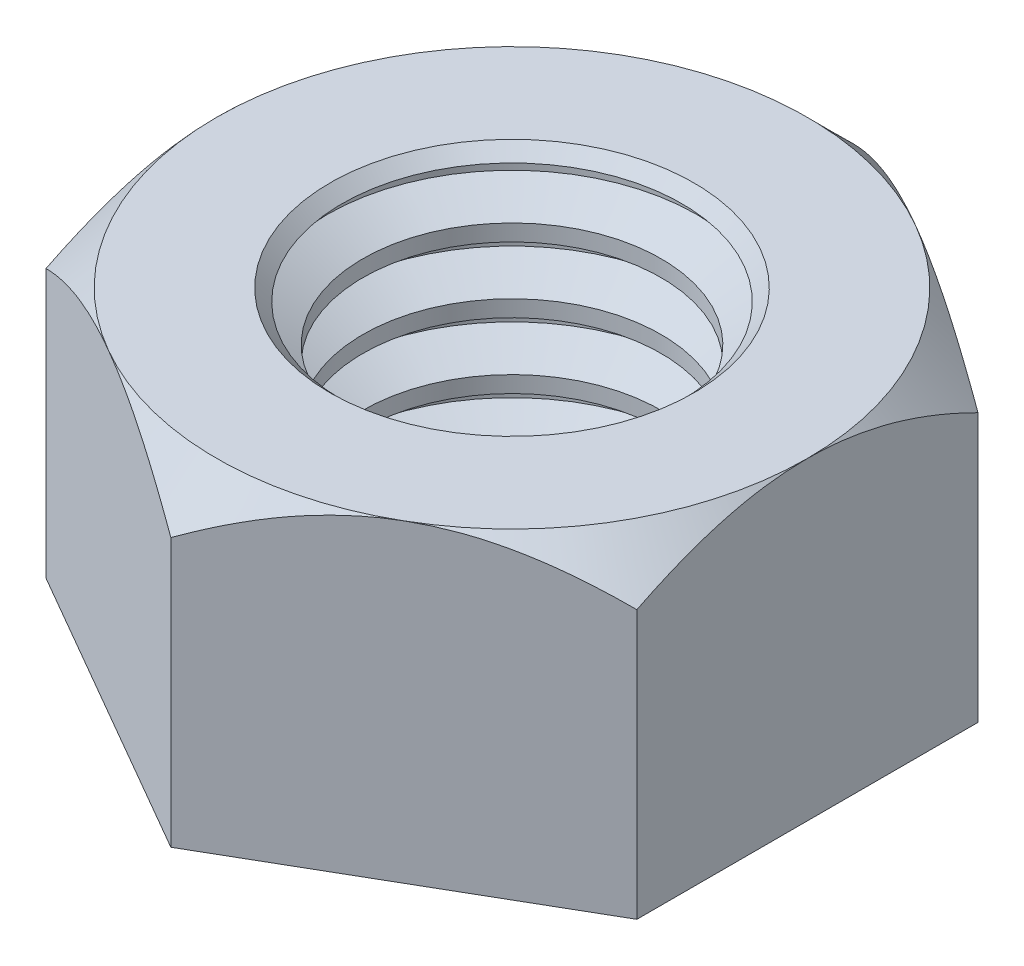
ISO-10303-21;
HEADER;
FILE_DESCRIPTION(('STEP AP214'),'2;1');
FILE_NAME('part.step','',(''),(''),'','','');
FILE_SCHEMA(('AUTOMOTIVE_DESIGN { 1 0 10303 214 1 1 1 1 }'));
ENDSEC;
DATA;
#1=APPLICATION_CONTEXT('core data for automotive mechanical design processes');
#2=APPLICATION_PROTOCOL_DEFINITION('international standard','automotive_design',2000,#1);
#3=PRODUCT_CONTEXT('',#1,'mechanical');
#4=PRODUCT('Part','Part','',(#3));
#5=PRODUCT_RELATED_PRODUCT_CATEGORY('part','',(#4));
#6=PRODUCT_DEFINITION_FORMATION('','',#4);
#7=PRODUCT_DEFINITION_CONTEXT('part definition',#1,'design');
#8=PRODUCT_DEFINITION('design','',#6,#7);
#9=PRODUCT_DEFINITION_SHAPE('','',#8);
#10=(LENGTH_UNIT() NAMED_UNIT(*) SI_UNIT(.MILLI.,.METRE.));
#11=(NAMED_UNIT(*) PLANE_ANGLE_UNIT() SI_UNIT($,.RADIAN.));
#12=(NAMED_UNIT(*) SI_UNIT($,.STERADIAN.) SOLID_ANGLE_UNIT());
#13=UNCERTAINTY_MEASURE_WITH_UNIT(LENGTH_MEASURE(1.E-05),#10,'distance_accuracy_value','');
#14=(GEOMETRIC_REPRESENTATION_CONTEXT(3) GLOBAL_UNCERTAINTY_ASSIGNED_CONTEXT((#13)) GLOBAL_UNIT_ASSIGNED_CONTEXT((#10,
#11,#12)) REPRESENTATION_CONTEXT('',''));
#15=CARTESIAN_POINT('',(0.,0.,0.));
#16=DIRECTION('',(0.,0.,1.));
#17=DIRECTION('',(1.,0.,0.));
#18=AXIS2_PLACEMENT_3D('',#15,#16,#17);
#19=CARTESIAN_POINT('',(-6.35,0.,-10.9985226280624));
#20=DIRECTION('',(0.,1.,0.));
#21=DIRECTION('',(0.,0.,1.));
#22=AXIS2_PLACEMENT_3D('',#19,#20,#21);
#23=PLANE('',#22);
#24=DIRECTION('',(-0.866025403784439,0.,-0.5));
#25=VECTOR('',#24,1.);
#26=CARTESIAN_POINT('',(6.35,0.,-3.66617420935413));
#27=LINE('',#26,#25);
#28=CARTESIAN_POINT('',(6.35,0.,-3.66617420935413));
#29=VERTEX_POINT('',#28);
#30=CARTESIAN_POINT('',(0.,0.,-7.33234841870825));
#31=VERTEX_POINT('',#30);
#32=EDGE_CURVE('E265',#29,#31,#27,.T.);
#33=ORIENTED_EDGE('',*,*,#32,.F.);
#34=DIRECTION('',(0.,0.,-1.));
#35=VECTOR('',#34,1.);
#36=CARTESIAN_POINT('',(6.35,0.,3.66617420935413));
#37=LINE('',#36,#35);
#38=CARTESIAN_POINT('',(6.35,0.,3.66617420935413));
#39=VERTEX_POINT('',#38);
#40=EDGE_CURVE('E272',#39,#29,#37,.T.);
#41=ORIENTED_EDGE('',*,*,#40,.F.);
#42=DIRECTION('',(0.866025403784439,0.,-0.5));
#43=VECTOR('',#42,1.);
#44=CARTESIAN_POINT('',(0.,0.,7.33234841870825));
#45=LINE('',#44,#43);
#46=CARTESIAN_POINT('',(0.,0.,7.33234841870825));
#47=VERTEX_POINT('',#46);
#48=EDGE_CURVE('E268',#47,#39,#45,.T.);
#49=ORIENTED_EDGE('',*,*,#48,.F.);
#50=DIRECTION('',(0.866025403784439,0.,0.5));
#51=VECTOR('',#50,1.);
#52=CARTESIAN_POINT('',(-6.35,0.,3.66617420935412));
#53=LINE('',#52,#51);
#54=CARTESIAN_POINT('',(-6.35,0.,3.66617420935412));
#55=VERTEX_POINT('',#54);
#56=EDGE_CURVE('E126',#55,#47,#53,.T.);
#57=ORIENTED_EDGE('',*,*,#56,.F.);
#58=DIRECTION('',(0.,0.,1.));
#59=VECTOR('',#58,1.);
#60=CARTESIAN_POINT('',(-6.35,0.,-3.66617420935413));
#61=LINE('',#60,#59);
#62=CARTESIAN_POINT('',(-6.35,0.,-3.66617420935413));
#63=VERTEX_POINT('',#62);
#64=EDGE_CURVE('E264',#63,#55,#61,.T.);
#65=ORIENTED_EDGE('',*,*,#64,.F.);
#66=DIRECTION('',(-0.866025403784439,0.,0.5));
#67=VECTOR('',#66,1.);
#68=CARTESIAN_POINT('',(0.,0.,-7.33234841870825));
#69=LINE('',#68,#67);
#70=EDGE_CURVE('E260',#31,#63,#69,.T.);
#71=ORIENTED_EDGE('',*,*,#70,.F.);
#72=EDGE_LOOP('',(#33,#41,#49,#57,#65,#71));
#73=FACE_BOUND('',#72,.T.);
#74=CARTESIAN_POINT('',(0.,0.,0.));
#75=DIRECTION('',(0.,1.,0.));
#76=DIRECTION('',(0.,0.,1.));
#77=AXIS2_PLACEMENT_3D('',#74,#75,#76);
#78=CIRCLE('',#77,3.20496370638455);
#79=CARTESIAN_POINT('',(0.,0.,3.20496370638455));
#80=VERTEX_POINT('',#79);
#81=EDGE_CURVE('E143',#80,#80,#78,.F.);
#82=ORIENTED_EDGE('',*,*,#81,.F.);
#83=EDGE_LOOP('',(#82));
#84=FACE_BOUND('',#83,.T.);
#85=ADVANCED_FACE('F33',(#73,#84),#23,.F.);
#86=CARTESIAN_POINT('',(-6.35,6.746875,-10.9985226280624));
#87=DIRECTION('',(0.,1.,0.));
#88=DIRECTION('',(0.,0.,1.));
#89=AXIS2_PLACEMENT_3D('',#86,#87,#88);
#90=PLANE('',#89);
#91=CARTESIAN_POINT('',(0.,6.746875,0.));
#92=DIRECTION('',(0.,1.,0.));
#93=DIRECTION('',(0.,0.,1.));
#94=AXIS2_PLACEMENT_3D('',#91,#92,#93);
#95=CIRCLE('',#94,3.91051926194011);
#96=CARTESIAN_POINT('',(0.,6.746875,3.91051926194011));
#97=VERTEX_POINT('',#96);
#98=EDGE_CURVE('E12',#97,#97,#95,.F.);
#99=ORIENTED_EDGE('',*,*,#98,.T.);
#100=EDGE_LOOP('',(#99));
#101=FACE_BOUND('',#100,.T.);
#102=CARTESIAN_POINT('',(0.,6.746875,0.));
#103=DIRECTION('',(0.,1.,0.));
#104=DIRECTION('',(0.,0.,1.));
#105=AXIS2_PLACEMENT_3D('',#102,#103,#104);
#106=CIRCLE('',#105,6.35);
#107=CARTESIAN_POINT('',(-3.175,6.746875,5.49926131403118));
#108=VERTEX_POINT('',#107);
#109=CARTESIAN_POINT('',(3.175,6.746875,5.49926131403119));
#110=VERTEX_POINT('',#109);
#111=EDGE_CURVE('E108',#108,#110,#106,.T.);
#112=ORIENTED_EDGE('',*,*,#111,.T.);
#113=CARTESIAN_POINT('',(0.,6.746875,0.));
#114=DIRECTION('',(0.,1.,0.));
#115=DIRECTION('',(0.,0.,1.));
#116=AXIS2_PLACEMENT_3D('',#113,#114,#115);
#117=CIRCLE('',#116,6.35);
#118=CARTESIAN_POINT('',(6.35,6.746875,0.));
#119=VERTEX_POINT('',#118);
#120=EDGE_CURVE('E48',#110,#119,#117,.T.);
#121=ORIENTED_EDGE('',*,*,#120,.T.);
#122=CARTESIAN_POINT('',(3.175,6.746875,-5.49926131403118));
#123=VERTEX_POINT('',#122);
#124=EDGE_CURVE('E142',#119,#123,#106,.T.);
#125=ORIENTED_EDGE('',*,*,#124,.T.);
#126=CARTESIAN_POINT('',(-3.175,6.746875,-5.49926131403118));
#127=VERTEX_POINT('',#126);
#128=EDGE_CURVE('E150',#123,#127,#106,.T.);
#129=ORIENTED_EDGE('',*,*,#128,.T.);
#130=CARTESIAN_POINT('',(-6.35,6.746875,0.));
#131=VERTEX_POINT('',#130);
#132=EDGE_CURVE('E153',#127,#131,#106,.T.);
#133=ORIENTED_EDGE('',*,*,#132,.T.);
#134=EDGE_CURVE('E141',#131,#108,#106,.T.);
#135=ORIENTED_EDGE('',*,*,#134,.T.);
#136=EDGE_LOOP('',(#112,#121,#125,#129,#133,#135));
#137=FACE_BOUND('',#136,.T.);
#138=ADVANCED_FACE('F160',(#101,#137),#90,.T.);
#139=CARTESIAN_POINT('',(6.35,6.746875,-3.66617420935413));
#140=DIRECTION('',(-0.5,0.,0.866025403784439));
#141=DIRECTION('',(0.866025403784439,0.,0.5));
#142=AXIS2_PLACEMENT_3D('',#139,#140,#141);
#143=PLANE('',#142);
#144=CARTESIAN_POINT('',(6.3502,5.76441110851033,-3.66605873930029));
#145=CARTESIAN_POINT('',(6.24101621236224,5.82744191368165,-3.72909602848409));
#146=CARTESIAN_POINT('',(6.13099318710209,5.88853839428113,-3.79261785173509));
#147=CARTESIAN_POINT('',(5.90910401695681,6.00627429485521,-3.92072562384873));
#148=CARTESIAN_POINT('',(5.79723690520502,6.0629112805866,-3.9853121309321));
#149=CARTESIAN_POINT('',(5.45758321961652,6.22573334808062,-4.18141127773787));
#150=CARTESIAN_POINT('',(5.22692132166516,6.3241349428346,-4.31458398661187));
#151=CARTESIAN_POINT('',(4.76177316691475,6.49264087292598,-4.58313739897008));
#152=CARTESIAN_POINT('',(4.52740579656347,6.56316972865114,-4.71844946333166));
#153=CARTESIAN_POINT('',(4.17200168912229,6.6447542724988,-4.92364212043392));
#154=CARTESIAN_POINT('',(4.05301040589897,6.6679034201819,-4.99234176983412));
#155=CARTESIAN_POINT('',(3.81402033641651,6.70560829441256,-5.13032275078347));
#156=CARTESIAN_POINT('',(3.69402170344377,6.7201653052021,-5.19960399383267));
#157=CARTESIAN_POINT('',(3.40160124808168,6.74457223903703,-5.36843302245252));
#158=CARTESIAN_POINT('',(3.22886435428594,6.74969325558986,-5.46816271458448));
#159=CARTESIAN_POINT('',(2.88370190212041,6.74109778389431,-5.66744234925639));
#160=CARTESIAN_POINT('',(2.71127647409617,6.72737469239663,-5.76699221654132));
#161=CARTESIAN_POINT('',(2.36805122036321,6.6818999287613,-5.96515340917673));
#162=CARTESIAN_POINT('',(2.19725343010598,6.65012809536871,-6.06376355935873));
#163=CARTESIAN_POINT('',(1.85859344778885,6.57028316446073,-6.25928899131328));
#164=CARTESIAN_POINT('',(1.6907310316661,6.5222113169194,-6.35620440244857));
#165=CARTESIAN_POINT('',(1.39274585815121,6.42331300735174,-6.52824622259191));
#166=CARTESIAN_POINT('',(1.26196325748996,6.37508758872928,-6.603753592289));
#167=CARTESIAN_POINT('',(1.00274574494885,6.27086541771053,-6.75341289293328));
#168=CARTESIAN_POINT('',(0.8743109043856,6.21486842968405,-6.8275647827058));
#169=CARTESIAN_POINT('',(0.620193438603675,6.09635835798893,-6.97427956998078));
#170=CARTESIAN_POINT('',(0.49450358615892,6.03386576602962,-7.04684664012416));
#171=CARTESIAN_POINT('',(0.245451295131915,5.90318493547322,-7.19063704739089));
#172=CARTESIAN_POINT('',(0.12208748533096,5.83500018986929,-7.26186117618773));
#173=CARTESIAN_POINT('',(-0.000199999999999847,5.76441110851033,-7.33246388876209));
#174=B_SPLINE_CURVE_WITH_KNOTS('',3,(#144,#145,#146,#147,#148,#149,#150,#151,#152,#153,#154,
#155,#156,#157,#158,#159,#160,#161,#162,#163,#164,#165,#166,#167,#168,#169,#170,#171,#172,#173),
.UNSPECIFIED.,.F.,.F.,(4,2,2,2,2,2,2,2,2,2,2,2,2,2,4),(0.,0.422833549986455,0.845896328892872,
1.6965893474527,2.53377423037831,2.95154563240735,3.36925457552425,3.96689987236255,
4.56475464624897,5.16327856767165,5.76175660138975,6.23711762004979,6.712493054574,
7.18641189114168,7.66004201531219),.UNSPECIFIED.);
#175=CARTESIAN_POINT('',(6.35,5.76452658129176,-3.66617420935413));
#176=VERTEX_POINT('',#175);
#177=EDGE_CURVE('E275',#176,#123,#174,.T.);
#178=ORIENTED_EDGE('',*,*,#177,.F.);
#179=DIRECTION('',(0.,-1.,0.));
#180=VECTOR('',#179,1.);
#181=CARTESIAN_POINT('',(6.35,6.746875,-3.66617420935413));
#182=LINE('',#181,#180);
#183=EDGE_CURVE('E133',#176,#29,#182,.T.);
#184=ORIENTED_EDGE('',*,*,#183,.T.);
#185=ORIENTED_EDGE('',*,*,#32,.T.);
#186=DIRECTION('',(0.,-1.,0.));
#187=VECTOR('',#186,1.);
#188=CARTESIAN_POINT('',(0.,6.746875,-7.33234841870825));
#189=LINE('',#188,#187);
#190=CARTESIAN_POINT('',(0.,5.76452658129176,-7.33234841870825));
#191=VERTEX_POINT('',#190);
#192=EDGE_CURVE('E138',#191,#31,#189,.T.);
#193=ORIENTED_EDGE('',*,*,#192,.F.);
#194=EDGE_CURVE('E212',#123,#191,#174,.T.);
#195=ORIENTED_EDGE('',*,*,#194,.F.);
#196=EDGE_LOOP('',(#178,#184,#185,#193,#195));
#197=FACE_BOUND('',#196,.T.);
#198=ADVANCED_FACE('F221',(#197),#143,.F.);
#199=CARTESIAN_POINT('',(0.,6.746875,-7.33234841870825));
#200=DIRECTION('',(0.5,0.,0.866025403784439));
#201=DIRECTION('',(0.866025403784439,0.,-0.5));
#202=AXIS2_PLACEMENT_3D('',#199,#200,#201);
#203=PLANE('',#202);
#204=CARTESIAN_POINT('',(0.00019999999999996,5.76441110851033,-7.33246388876209));
#205=CARTESIAN_POINT('',(-0.108983787637755,5.82744191368165,-7.26942659957828));
#206=CARTESIAN_POINT('',(-0.219006812897905,5.88853839428112,-7.20590477632728));
#207=CARTESIAN_POINT('',(-0.440895983043188,6.00627429485521,-7.07779700421364));
#208=CARTESIAN_POINT('',(-0.552763094794981,6.0629112805866,-7.01321049713027));
#209=CARTESIAN_POINT('',(-0.892416780383478,6.22573334808062,-6.81711135032451));
#210=CARTESIAN_POINT('',(-1.12307867833484,6.3241349428346,-6.6839386414505));
#211=CARTESIAN_POINT('',(-1.58822683308525,6.49264087292598,-6.41538522909229));
#212=CARTESIAN_POINT('',(-1.82259420343653,6.56316972865114,-6.28007316473072));
#213=CARTESIAN_POINT('',(-2.17799831087771,6.6447542724988,-6.07488050762845));
#214=CARTESIAN_POINT('',(-2.29698959410103,6.6679034201819,-6.00618085822825));
#215=CARTESIAN_POINT('',(-2.53597966358349,6.70560829441256,-5.86819987727891));
#216=CARTESIAN_POINT('',(-2.65597829655623,6.7201653052021,-5.79891863422971));
#217=CARTESIAN_POINT('',(-2.94839875191832,6.74457223903703,-5.63008960560985));
#218=CARTESIAN_POINT('',(-3.12113564571406,6.74969325558986,-5.5303599134779));
#219=CARTESIAN_POINT('',(-3.46629809787959,6.74109778389431,-5.33108027880598));
#220=CARTESIAN_POINT('',(-3.63872352590383,6.72737469239663,-5.23153041152105));
#221=CARTESIAN_POINT('',(-3.98194877963679,6.6818999287613,-5.03336921888565));
#222=CARTESIAN_POINT('',(-4.15274656989402,6.65012809536871,-4.93475906870364));
#223=CARTESIAN_POINT('',(-4.49140655221115,6.57028316446073,-4.73923363674909));
#224=CARTESIAN_POINT('',(-4.6592689683339,6.5222113169194,-4.6423182256138));
#225=CARTESIAN_POINT('',(-4.95725414184879,6.42331300735174,-4.47027640547046));
#226=CARTESIAN_POINT('',(-5.08803674251004,6.37508758872928,-4.39476903577337));
#227=CARTESIAN_POINT('',(-5.34725425505115,6.27086541771053,-4.24510973512909));
#228=CARTESIAN_POINT('',(-5.4756890956144,6.21486842968404,-4.17095784535658));
#229=CARTESIAN_POINT('',(-5.72980656139632,6.09635835798892,-4.0242430580816));
#230=CARTESIAN_POINT('',(-5.85549641384108,6.03386576602962,-3.95167598793821));
#231=CARTESIAN_POINT('',(-6.10454870486809,5.90318493547322,-3.80788558067148));
#232=CARTESIAN_POINT('',(-6.22791251466904,5.83500018986929,-3.73666145187464));
#233=CARTESIAN_POINT('',(-6.3502,5.76441110851033,-3.66605873930029));
#234=B_SPLINE_CURVE_WITH_KNOTS('',3,(#204,#205,#206,#207,#208,#209,#210,#211,#212,#213,#214,
#215,#216,#217,#218,#219,#220,#221,#222,#223,#224,#225,#226,#227,#228,#229,#230,#231,#232,#233),
.UNSPECIFIED.,.F.,.F.,(4,2,2,2,2,2,2,2,2,2,2,2,2,2,4),(0.,0.422833549986455,0.845896328892872,
1.6965893474527,2.53377423037831,2.95154563240735,3.36925457552425,3.96689987236255,
4.56475464624897,5.16327856767165,5.76175660138975,6.2371176200498,6.712493054574,
7.18641189114168,7.66004201531219),.UNSPECIFIED.);
#235=EDGE_CURVE('E211',#191,#127,#234,.T.);
#236=ORIENTED_EDGE('',*,*,#235,.F.);
#237=ORIENTED_EDGE('',*,*,#192,.T.);
#238=ORIENTED_EDGE('',*,*,#70,.T.);
#239=DIRECTION('',(0.,-1.,0.));
#240=VECTOR('',#239,1.);
#241=CARTESIAN_POINT('',(-6.35,6.746875,-3.66617420935413));
#242=LINE('',#241,#240);
#243=CARTESIAN_POINT('',(-6.35,5.76452658129176,-3.66617420935412));
#244=VERTEX_POINT('',#243);
#245=EDGE_CURVE('E131',#244,#63,#242,.T.);
#246=ORIENTED_EDGE('',*,*,#245,.F.);
#247=EDGE_CURVE('E206',#127,#244,#234,.T.);
#248=ORIENTED_EDGE('',*,*,#247,.F.);
#249=EDGE_LOOP('',(#236,#237,#238,#246,#248));
#250=FACE_BOUND('',#249,.T.);
#251=ADVANCED_FACE('F217',(#250),#203,.F.);
#252=CARTESIAN_POINT('',(-6.35,6.746875,-3.66617420935413));
#253=DIRECTION('',(1.,0.,0.));
#254=DIRECTION('',(0.,0.,-1.));
#255=AXIS2_PLACEMENT_3D('',#252,#253,#254);
#256=PLANE('',#255);
#257=CARTESIAN_POINT('',(-6.35,3.15402057041651,-7.65100347718447));
#258=CARTESIAN_POINT('',(-6.35,3.29622617067336,-7.46615881597352));
#259=CARTESIAN_POINT('',(-6.35,3.43715750285695,-7.28031817729555));
#260=CARTESIAN_POINT('',(-6.35,3.71588946436755,-6.90623785631214));
#261=CARTESIAN_POINT('',(-6.35,3.85368934512118,-6.7179976168253));
#262=CARTESIAN_POINT('',(-6.35,4.1265568822672,-6.3373354002406));
#263=CARTESIAN_POINT('',(-6.35,4.26159525846541,-6.14489236557237));
#264=CARTESIAN_POINT('',(-6.35,4.52697263928383,-5.75680348065273));
#265=CARTESIAN_POINT('',(-6.35,4.65731196748414,-5.56115785228862));
#266=CARTESIAN_POINT('',(-6.35,4.92030267151353,-5.1536005613427));
#267=CARTESIAN_POINT('',(-6.35,5.05257660560262,-4.94144411293475));
#268=CARTESIAN_POINT('',(-6.35,5.30891443761725,-4.51214904946088));
#269=CARTESIAN_POINT('',(-6.35,5.43297695386873,-4.29500960417926));
#270=CARTESIAN_POINT('',(-6.35,5.67024986626302,-3.85568914642183));
#271=CARTESIAN_POINT('',(-6.35,5.78349211886493,-3.63352547493339));
#272=CARTESIAN_POINT('',(-6.35,5.99658733556633,-3.1829177779084));
#273=CARTESIAN_POINT('',(-6.35,6.09644661598976,-2.95447677685027));
#274=CARTESIAN_POINT('',(-6.35,6.27014039459256,-2.51369343803001));
#275=CARTESIAN_POINT('',(-6.35,6.34557046634183,-2.30198630503797));
#276=CARTESIAN_POINT('',(-6.35,6.47948475446259,-1.8731783783197));
#277=CARTESIAN_POINT('',(-6.35,6.53796789148012,-1.65607724200393));
#278=CARTESIAN_POINT('',(-6.35,6.63384784955585,-1.22155906089828));
#279=CARTESIAN_POINT('',(-6.35,6.6716276516483,-1.00422796819583));
#280=CARTESIAN_POINT('',(-6.35,6.72531278297427,-0.566865625733189));
#281=CARTESIAN_POINT('',(-6.35,6.74122265054003,-0.346834945741438));
#282=CARTESIAN_POINT('',(-6.35,6.74981267971825,0.0840592394673551));
#283=CARTESIAN_POINT('',(-6.35,6.74347728688616,0.294903302487628));
#284=CARTESIAN_POINT('',(-6.35,6.71018653562564,0.714946099591338));
#285=CARTESIAN_POINT('',(-6.35,6.68322930425675,0.924144682483431));
#286=CARTESIAN_POINT('',(-6.35,6.60976091898456,1.34292790030678));
#287=CARTESIAN_POINT('',(-6.35,6.56290453739441,1.55245093571273));
#288=CARTESIAN_POINT('',(-6.35,6.45223738326224,1.9668829402945));
#289=CARTESIAN_POINT('',(-6.35,6.38842757365462,2.1717921708121));
#290=CARTESIAN_POINT('',(-6.35,6.24257147703944,2.58828518442083));
#291=CARTESIAN_POINT('',(-6.35,6.15968506637132,2.79957138674377));
#292=CARTESIAN_POINT('',(-6.35,5.98110684321773,3.21670911818827));
#293=CARTESIAN_POINT('',(-6.35,5.88540925675523,3.42255814640287));
#294=CARTESIAN_POINT('',(-6.35,5.68347812974868,3.82979366416488));
#295=CARTESIAN_POINT('',(-6.35,5.57721213830068,4.03116393101677));
#296=CARTESIAN_POINT('',(-6.35,5.35648270332218,4.42929016080612));
#297=CARTESIAN_POINT('',(-6.35,5.24202052195303,4.62604682804047));
#298=CARTESIAN_POINT('',(-6.35,5.012313936172,5.0059325877212));
#299=CARTESIAN_POINT('',(-6.35,4.89738727787841,5.18925483318811));
#300=CARTESIAN_POINT('',(-6.35,4.66264210387851,5.55274971013636));
#301=CARTESIAN_POINT('',(-6.35,4.54282322140858,5.73292210402603));
#302=CARTESIAN_POINT('',(-6.35,4.3001414337507,6.08908080052987));
#303=CARTESIAN_POINT('',(-6.35,4.17731069255796,6.26508909833825));
#304=CARTESIAN_POINT('',(-6.35,3.92835655040354,6.61469109925072));
#305=CARTESIAN_POINT('',(-6.35,3.80223406644713,6.78828545459909));
#306=CARTESIAN_POINT('',(-6.35,3.67476418704788,6.96086719967777));
#307=B_SPLINE_CURVE_WITH_KNOTS('',3,(#257,#258,#259,#260,#261,#262,#263,#264,#265,#266,#267,
#268,#269,#270,#271,#272,#273,#274,#275,#276,#277,#278,#279,#280,#281,#282,#283,#284,#285,#286,
#287,#288,#289,#290,#291,#292,#293,#294,#295,#296,#297,#298,#299,#300,#301,#302,#303,#304,#305,
#306),.UNSPECIFIED.,.F.,.F.,(4,2,2,2,2,2,2,2,2,2,2,2,2,2,2,2,2,2,2,2,2,2,2,2,4),(0.,
0.699662629537566,1.3994907904591,2.10471799103524,2.80989653600046,3.55978929418655,
4.30980791213761,5.05754554131291,5.80492901060113,6.47857818338588,7.15227025160757,
7.81303876697058,8.47367014246279,9.10544129450484,9.73726983281047,10.3805389959712,
11.0237716300225,11.7041377377312,12.3848115242748,13.0676439780204,13.7503715050955,
14.3993849783182,15.0484471968884,15.6922981691657,16.3359716542344),.UNSPECIFIED.);
#308=EDGE_CURVE('E165',#244,#131,#307,.T.);
#309=ORIENTED_EDGE('',*,*,#308,.F.);
#310=ORIENTED_EDGE('',*,*,#245,.T.);
#311=ORIENTED_EDGE('',*,*,#64,.T.);
#312=DIRECTION('',(0.,-1.,0.));
#313=VECTOR('',#312,1.);
#314=CARTESIAN_POINT('',(-6.35,6.746875,3.66617420935412));
#315=LINE('',#314,#313);
#316=CARTESIAN_POINT('',(-6.35,5.76452658129176,3.66617420935412));
#317=VERTEX_POINT('',#316);
#318=EDGE_CURVE('E128',#317,#55,#315,.T.);
#319=ORIENTED_EDGE('',*,*,#318,.F.);
#320=EDGE_CURVE('E163',#131,#317,#307,.T.);
#321=ORIENTED_EDGE('',*,*,#320,.F.);
#322=EDGE_LOOP('',(#309,#310,#311,#319,#321));
#323=FACE_BOUND('',#322,.T.);
#324=ADVANCED_FACE('F220',(#323),#256,.F.);
#325=CARTESIAN_POINT('',(-6.35,6.746875,3.66617420935412));
#326=DIRECTION('',(0.5,0.,-0.866025403784439));
#327=DIRECTION('',(-0.866025403784439,0.,-0.5));
#328=AXIS2_PLACEMENT_3D('',#325,#326,#327);
#329=PLANE('',#328);
#330=CARTESIAN_POINT('',(-6.3502,5.76441110851033,3.66605873930029));
#331=CARTESIAN_POINT('',(-6.24101621236225,5.82744191368165,3.72909602848409));
#332=CARTESIAN_POINT('',(-6.1309931871021,5.88853839428112,3.79261785173509));
#333=CARTESIAN_POINT('',(-5.90910401695681,6.00627429485521,3.92072562384873));
#334=CARTESIAN_POINT('',(-5.79723690520502,6.0629112805866,3.9853121309321));
#335=CARTESIAN_POINT('',(-5.45758321961652,6.22573334808061,4.18141127773786));
#336=CARTESIAN_POINT('',(-5.22692132166516,6.3241349428346,4.31458398661187));
#337=CARTESIAN_POINT('',(-4.76177316691475,6.49264087292598,4.58313739897008));
#338=CARTESIAN_POINT('',(-4.52740579656347,6.56316972865114,4.71844946333166));
#339=CARTESIAN_POINT('',(-4.1720016891223,6.6447542724988,4.92364212043392));
#340=CARTESIAN_POINT('',(-4.05301040589897,6.6679034201819,4.99234176983412));
#341=CARTESIAN_POINT('',(-3.81402033641651,6.70560829441256,5.13032275078347));
#342=CARTESIAN_POINT('',(-3.69402170344377,6.7201653052021,5.19960399383267));
#343=CARTESIAN_POINT('',(-3.40160124808168,6.74457223903703,5.36843302245252));
#344=CARTESIAN_POINT('',(-3.22886435428594,6.74969325558985,5.46816271458448));
#345=CARTESIAN_POINT('',(-2.88370190212041,6.74109778389431,5.66744234925639));
#346=CARTESIAN_POINT('',(-2.71127647409617,6.72737469239663,5.76699221654132));
#347=CARTESIAN_POINT('',(-2.36805122036321,6.6818999287613,5.96515340917673));
#348=CARTESIAN_POINT('',(-2.19725343010598,6.65012809536871,6.06376355935873));
#349=CARTESIAN_POINT('',(-1.85859344778885,6.57028316446073,6.25928899131328));
#350=CARTESIAN_POINT('',(-1.6907310316661,6.5222113169194,6.35620440244857));
#351=CARTESIAN_POINT('',(-1.39274585815121,6.42331300735174,6.52824622259191));
#352=CARTESIAN_POINT('',(-1.26196325748996,6.37508758872928,6.603753592289));
#353=CARTESIAN_POINT('',(-1.00274574494885,6.27086541771053,6.75341289293328));
#354=CARTESIAN_POINT('',(-0.874310904385601,6.21486842968405,6.8275647827058));
#355=CARTESIAN_POINT('',(-0.620193438603678,6.09635835798892,6.97427956998078));
#356=CARTESIAN_POINT('',(-0.494503586158923,6.03386576602962,7.04684664012416));
#357=CARTESIAN_POINT('',(-0.245451295131917,5.90318493547322,7.1906370473909));
#358=CARTESIAN_POINT('',(-0.122087485330962,5.83500018986929,7.26186117618774));
#359=CARTESIAN_POINT('',(0.000199999999998812,5.76441110851033,7.33246388876209));
#360=B_SPLINE_CURVE_WITH_KNOTS('',3,(#330,#331,#332,#333,#334,#335,#336,#337,#338,#339,#340,
#341,#342,#343,#344,#345,#346,#347,#348,#349,#350,#351,#352,#353,#354,#355,#356,#357,#358,#359),
.UNSPECIFIED.,.F.,.F.,(4,2,2,2,2,2,2,2,2,2,2,2,2,2,4),(0.,0.422833549986456,0.845896328892872,
1.6965893474527,2.53377423037831,2.95154563240735,3.36925457552425,3.96689987236255,
4.56475464624897,5.16327856767165,5.76175660138975,6.2371176200498,6.712493054574,
7.18641189114168,7.66004201531219),.UNSPECIFIED.);
#361=EDGE_CURVE('E113',#317,#108,#360,.T.);
#362=ORIENTED_EDGE('',*,*,#361,.F.);
#363=ORIENTED_EDGE('',*,*,#318,.T.);
#364=ORIENTED_EDGE('',*,*,#56,.T.);
#365=DIRECTION('',(0.,-1.,0.));
#366=VECTOR('',#365,1.);
#367=CARTESIAN_POINT('',(0.,6.746875,7.33234841870825));
#368=LINE('',#367,#366);
#369=CARTESIAN_POINT('',(0.,5.76452658129176,7.33234841870825));
#370=VERTEX_POINT('',#369);
#371=EDGE_CURVE('E119',#370,#47,#368,.T.);
#372=ORIENTED_EDGE('',*,*,#371,.F.);
#373=EDGE_CURVE('E104',#108,#370,#360,.T.);
#374=ORIENTED_EDGE('',*,*,#373,.F.);
#375=EDGE_LOOP('',(#362,#363,#364,#372,#374));
#376=FACE_BOUND('',#375,.T.);
#377=ADVANCED_FACE('F124',(#376),#329,.F.);
#378=CARTESIAN_POINT('',(0.,6.746875,7.33234841870825));
#379=DIRECTION('',(-0.5,0.,-0.866025403784439));
#380=DIRECTION('',(-0.866025403784439,0.,0.5));
#381=AXIS2_PLACEMENT_3D('',#378,#379,#380);
#382=PLANE('',#381);
#383=CARTESIAN_POINT('',(-0.000200000000001121,5.76441110851033,7.33246388876209));
#384=CARTESIAN_POINT('',(0.108983787637754,5.82744191368165,7.26942659957829));
#385=CARTESIAN_POINT('',(0.219006812897905,5.88853839428112,7.20590477632728));
#386=CARTESIAN_POINT('',(0.440895983043187,6.00627429485521,7.07779700421364));
#387=CARTESIAN_POINT('',(0.55276309479498,6.0629112805866,7.01321049713028));
#388=CARTESIAN_POINT('',(0.892416780383476,6.22573334808062,6.81711135032451));
#389=CARTESIAN_POINT('',(1.12307867833484,6.3241349428346,6.6839386414505));
#390=CARTESIAN_POINT('',(1.58822683308525,6.49264087292598,6.41538522909229));
#391=CARTESIAN_POINT('',(1.82259420343653,6.56316972865114,6.28007316473072));
#392=CARTESIAN_POINT('',(2.17799831087771,6.64475427249879,6.07488050762846));
#393=CARTESIAN_POINT('',(2.29698959410103,6.6679034201819,6.00618085822825));
#394=CARTESIAN_POINT('',(2.53597966358349,6.70560829441256,5.86819987727891));
#395=CARTESIAN_POINT('',(2.65597829655623,6.7201653052021,5.79891863422971));
#396=CARTESIAN_POINT('',(2.94839875191832,6.74457223903703,5.63008960560985));
#397=CARTESIAN_POINT('',(3.12113564571406,6.74969325558986,5.5303599134779));
#398=CARTESIAN_POINT('',(3.46629809787959,6.74109778389431,5.33108027880598));
#399=CARTESIAN_POINT('',(3.63872352590383,6.72737469239663,5.23153041152105));
#400=CARTESIAN_POINT('',(3.98194877963679,6.6818999287613,5.03336921888565));
#401=CARTESIAN_POINT('',(4.15274656989402,6.65012809536871,4.93475906870364));
#402=CARTESIAN_POINT('',(4.49140655221115,6.57028316446073,4.73923363674909));
#403=CARTESIAN_POINT('',(4.6592689683339,6.5222113169194,4.6423182256138));
#404=CARTESIAN_POINT('',(4.95725414184879,6.42331300735174,4.47027640547047));
#405=CARTESIAN_POINT('',(5.08803674251004,6.37508758872928,4.39476903577337));
#406=CARTESIAN_POINT('',(5.34725425505115,6.27086541771053,4.2451097351291));
#407=CARTESIAN_POINT('',(5.4756890956144,6.21486842968404,4.17095784535658));
#408=CARTESIAN_POINT('',(5.72980656139632,6.09635835798892,4.0242430580816));
#409=CARTESIAN_POINT('',(5.85549641384108,6.03386576602962,3.95167598793822));
#410=CARTESIAN_POINT('',(6.10454870486808,5.90318493547322,3.80788558067148));
#411=CARTESIAN_POINT('',(6.22791251466904,5.83500018986929,3.73666145187464));
#412=CARTESIAN_POINT('',(6.3502,5.76441110851033,3.66605873930029));
#413=B_SPLINE_CURVE_WITH_KNOTS('',3,(#383,#384,#385,#386,#387,#388,#389,#390,#391,#392,#393,
#394,#395,#396,#397,#398,#399,#400,#401,#402,#403,#404,#405,#406,#407,#408,#409,#410,#411,#412),
.UNSPECIFIED.,.F.,.F.,(4,2,2,2,2,2,2,2,2,2,2,2,2,2,4),(0.,0.422833549986455,0.845896328892872,
1.6965893474527,2.53377423037831,2.95154563240735,3.36925457552426,3.96689987236255,
4.56475464624897,5.16327856767165,5.76175660138975,6.2371176200498,6.712493054574,
7.18641189114168,7.66004201531219),.UNSPECIFIED.);
#414=EDGE_CURVE('E107',#370,#110,#413,.T.);
#415=ORIENTED_EDGE('',*,*,#414,.F.);
#416=ORIENTED_EDGE('',*,*,#371,.T.);
#417=ORIENTED_EDGE('',*,*,#48,.T.);
#418=DIRECTION('',(0.,-1.,0.));
#419=VECTOR('',#418,1.);
#420=CARTESIAN_POINT('',(6.35,6.746875,3.66617420935413));
#421=LINE('',#420,#419);
#422=CARTESIAN_POINT('',(6.35,5.76452658129176,3.66617420935413));
#423=VERTEX_POINT('',#422);
#424=EDGE_CURVE('E129',#423,#39,#421,.T.);
#425=ORIENTED_EDGE('',*,*,#424,.F.);
#426=EDGE_CURVE('E122',#110,#423,#413,.T.);
#427=ORIENTED_EDGE('',*,*,#426,.F.);
#428=EDGE_LOOP('',(#415,#416,#417,#425,#427));
#429=FACE_BOUND('',#428,.T.);
#430=ADVANCED_FACE('F117',(#429),#382,.F.);
#431=CARTESIAN_POINT('',(6.35,6.746875,3.66617420935413));
#432=DIRECTION('',(-1.,0.,0.));
#433=DIRECTION('',(0.,0.,1.));
#434=AXIS2_PLACEMENT_3D('',#431,#432,#433);
#435=PLANE('',#434);
#436=CARTESIAN_POINT('',(6.35,3.15402057041651,-7.65100347718447));
#437=CARTESIAN_POINT('',(6.35,3.29622617067336,-7.46615881597352));
#438=CARTESIAN_POINT('',(6.35,3.43715750285695,-7.28031817729555));
#439=CARTESIAN_POINT('',(6.35,3.71588946436755,-6.90623785631214));
#440=CARTESIAN_POINT('',(6.35,3.85368934512118,-6.71799761682531));
#441=CARTESIAN_POINT('',(6.35,4.1265568822672,-6.3373354002406));
#442=CARTESIAN_POINT('',(6.35,4.26159525846541,-6.14489236557238));
#443=CARTESIAN_POINT('',(6.35,4.52697263928383,-5.75680348065273));
#444=CARTESIAN_POINT('',(6.35,4.65731196748414,-5.56115785228862));
#445=CARTESIAN_POINT('',(6.35,4.92030267151353,-5.1536005613427));
#446=CARTESIAN_POINT('',(6.35,5.05257660560262,-4.94144411293475));
#447=CARTESIAN_POINT('',(6.35,5.30891443761725,-4.51214904946089));
#448=CARTESIAN_POINT('',(6.35,5.43297695386873,-4.29500960417926));
#449=CARTESIAN_POINT('',(6.35,5.67024986626302,-3.85568914642183));
#450=CARTESIAN_POINT('',(6.35,5.78349211886493,-3.63352547493339));
#451=CARTESIAN_POINT('',(6.35,5.99658733556633,-3.1829177779084));
#452=CARTESIAN_POINT('',(6.35,6.09644661598976,-2.95447677685027));
#453=CARTESIAN_POINT('',(6.35,6.27014039459256,-2.51369343803001));
#454=CARTESIAN_POINT('',(6.35,6.34557046634183,-2.30198630503797));
#455=CARTESIAN_POINT('',(6.35,6.47948475446259,-1.87317837831971));
#456=CARTESIAN_POINT('',(6.35,6.53796789148013,-1.65607724200393));
#457=CARTESIAN_POINT('',(6.35,6.63384784955586,-1.22155906089828));
#458=CARTESIAN_POINT('',(6.35,6.6716276516483,-1.00422796819583));
#459=CARTESIAN_POINT('',(6.35,6.72531278297427,-0.56686562573319));
#460=CARTESIAN_POINT('',(6.35,6.74122265054003,-0.346834945741438));
#461=CARTESIAN_POINT('',(6.35,6.74981267971825,0.0840592394673539));
#462=CARTESIAN_POINT('',(6.35,6.74347728688616,0.294903302487627));
#463=CARTESIAN_POINT('',(6.35,6.71018653562564,0.714946099591337));
#464=CARTESIAN_POINT('',(6.35,6.68322930425675,0.92414468248343));
#465=CARTESIAN_POINT('',(6.35,6.60976091898456,1.34292790030678));
#466=CARTESIAN_POINT('',(6.35,6.56290453739441,1.55245093571272));
#467=CARTESIAN_POINT('',(6.35,6.45223738326224,1.9668829402945));
#468=CARTESIAN_POINT('',(6.35,6.38842757365462,2.1717921708121));
#469=CARTESIAN_POINT('',(6.35,6.24257147703944,2.58828518442083));
#470=CARTESIAN_POINT('',(6.35,6.15968506637132,2.79957138674377));
#471=CARTESIAN_POINT('',(6.35,5.98110684321773,3.21670911818826));
#472=CARTESIAN_POINT('',(6.35,5.88540925675523,3.42255814640287));
#473=CARTESIAN_POINT('',(6.35,5.68347812974869,3.82979366416488));
#474=CARTESIAN_POINT('',(6.35,5.57721213830068,4.03116393101676));
#475=CARTESIAN_POINT('',(6.35,5.35648270332219,4.42929016080612));
#476=CARTESIAN_POINT('',(6.35,5.24202052195304,4.62604682804046));
#477=CARTESIAN_POINT('',(6.35,5.012313936172,5.00593258772119));
#478=CARTESIAN_POINT('',(6.35,4.89738727787842,5.18925483318811));
#479=CARTESIAN_POINT('',(6.35,4.66264210387851,5.55274971013636));
#480=CARTESIAN_POINT('',(6.35,4.54282322140858,5.73292210402603));
#481=CARTESIAN_POINT('',(6.35,4.3001414337507,6.08908080052987));
#482=CARTESIAN_POINT('',(6.35,4.17731069255796,6.26508909833824));
#483=CARTESIAN_POINT('',(6.35,3.92835655040354,6.61469109925071));
#484=CARTESIAN_POINT('',(6.35,3.80223406644713,6.78828545459909));
#485=CARTESIAN_POINT('',(6.35,3.67476418704789,6.96086719967777));
#486=B_SPLINE_CURVE_WITH_KNOTS('',3,(#436,#437,#438,#439,#440,#441,#442,#443,#444,#445,#446,
#447,#448,#449,#450,#451,#452,#453,#454,#455,#456,#457,#458,#459,#460,#461,#462,#463,#464,#465,
#466,#467,#468,#469,#470,#471,#472,#473,#474,#475,#476,#477,#478,#479,#480,#481,#482,#483,#484,
#485),.UNSPECIFIED.,.F.,.F.,(4,2,2,2,2,2,2,2,2,2,2,2,2,2,2,2,2,2,2,2,2,2,2,2,4),(0.,
0.699662629537567,1.39949079045911,2.10471799103524,2.80989653600046,3.55978929418655,
4.30980791213762,5.05754554131291,5.80492901060113,6.47857818338589,7.15227025160757,
7.81303876697058,8.4736701424628,9.10544129450485,9.73726983281048,10.3805389959713,
11.0237716300225,11.7041377377312,12.3848115242749,13.0676439780204,13.7503715050955,
14.3993849783183,15.0484471968884,15.6922981691658,16.3359716542344),.UNSPECIFIED.);
#487=EDGE_CURVE('E296',#423,#119,#486,.F.);
#488=ORIENTED_EDGE('',*,*,#487,.F.);
#489=ORIENTED_EDGE('',*,*,#424,.T.);
#490=ORIENTED_EDGE('',*,*,#40,.T.);
#491=ORIENTED_EDGE('',*,*,#183,.F.);
#492=EDGE_CURVE('E196',#119,#176,#486,.F.);
#493=ORIENTED_EDGE('',*,*,#492,.F.);
#494=EDGE_LOOP('',(#488,#489,#490,#491,#493));
#495=FACE_BOUND('',#494,.T.);
#496=ADVANCED_FACE('F238',(#495),#435,.F.);
#497=CARTESIAN_POINT('',(0.,6.746875,0.));
#498=DIRECTION('',(0.,-1.,0.));
#499=DIRECTION('',(0.,0.,-1.));
#500=AXIS2_PLACEMENT_3D('',#497,#498,#499);
#501=CONICAL_SURFACE('',#500,6.35,0.785398163397454);
#502=ORIENTED_EDGE('',*,*,#373,.T.);
#503=ORIENTED_EDGE('',*,*,#414,.T.);
#504=ORIENTED_EDGE('',*,*,#111,.F.);
#505=EDGE_LOOP('',(#502,#503,#504));
#506=FACE_BOUND('',#505,.T.);
#507=ADVANCED_FACE('F106',(#506),#501,.T.);
#508=ORIENTED_EDGE('',*,*,#320,.T.);
#509=ORIENTED_EDGE('',*,*,#361,.T.);
#510=ORIENTED_EDGE('',*,*,#134,.F.);
#511=EDGE_LOOP('',(#508,#509,#510));
#512=FACE_BOUND('',#511,.T.);
#513=ADVANCED_FACE('F162',(#512),#501,.T.);
#514=ORIENTED_EDGE('',*,*,#247,.T.);
#515=ORIENTED_EDGE('',*,*,#308,.T.);
#516=ORIENTED_EDGE('',*,*,#132,.F.);
#517=EDGE_LOOP('',(#514,#515,#516));
#518=FACE_BOUND('',#517,.T.);
#519=ADVANCED_FACE('F280',(#518),#501,.T.);
#520=ORIENTED_EDGE('',*,*,#194,.T.);
#521=ORIENTED_EDGE('',*,*,#235,.T.);
#522=ORIENTED_EDGE('',*,*,#128,.F.);
#523=EDGE_LOOP('',(#520,#521,#522));
#524=FACE_BOUND('',#523,.T.);
#525=ADVANCED_FACE('F189',(#524),#501,.T.);
#526=ORIENTED_EDGE('',*,*,#177,.T.);
#527=ORIENTED_EDGE('',*,*,#124,.F.);
#528=ORIENTED_EDGE('',*,*,#492,.T.);
#529=EDGE_LOOP('',(#526,#527,#528));
#530=FACE_BOUND('',#529,.T.);
#531=ADVANCED_FACE('F183',(#530),#501,.T.);
#532=ORIENTED_EDGE('',*,*,#426,.T.);
#533=ORIENTED_EDGE('',*,*,#487,.T.);
#534=ORIENTED_EDGE('',*,*,#120,.F.);
#535=EDGE_LOOP('',(#532,#533,#534));
#536=FACE_BOUND('',#535,.T.);
#537=ADVANCED_FACE('F188',(#536),#501,.T.);
#538=CARTESIAN_POINT('',(0.,6.30590277777778,0.));
#539=DIRECTION('',(0.,-1.,0.));
#540=DIRECTION('',(0.,0.,-1.));
#541=AXIS2_PLACEMENT_3D('',#538,#539,#540);
#542=CONICAL_SURFACE('',#541,3.96875,1.0471975511966);
#543=CARTESIAN_POINT('',(0.,6.48862374288542,0.));
#544=DIRECTION('',(0.,1.,0.));
#545=DIRECTION('',(0.,0.,1.));
#546=AXIS2_PLACEMENT_3D('',#543,#544,#545);
#547=CIRCLE('',#546,3.65226800482553);
#548=CARTESIAN_POINT('',(0.,6.48862374288542,3.65226800482553));
#549=VERTEX_POINT('',#548);
#550=EDGE_CURVE('E41',#549,#549,#547,.T.);
#551=ORIENTED_EDGE('',*,*,#550,.T.);
#552=EDGE_LOOP('',(#551));
#553=FACE_BOUND('',#552,.T.);
#554=CARTESIAN_POINT('',(0.,6.30590277777778,0.));
#555=DIRECTION('',(0.,1.,0.));
#556=DIRECTION('',(0.,0.,1.));
#557=AXIS2_PLACEMENT_3D('',#554,#555,#556);
#558=CIRCLE('',#557,3.96875);
#559=CARTESIAN_POINT('',(0.,6.30590277777778,3.96875));
#560=VERTEX_POINT('',#559);
#561=EDGE_CURVE('E297',#560,#560,#558,.T.);
#562=ORIENTED_EDGE('',*,*,#561,.F.);
#563=EDGE_LOOP('',(#562));
#564=FACE_BOUND('',#563,.T.);
#565=ADVANCED_FACE('F191',(#553,#564),#542,.F.);
#566=CARTESIAN_POINT('',(0.,1.66357854098429,0.));
#567=DIRECTION('',(0.,1.,0.));
#568=DIRECTION('',(0.,0.,1.));
#569=AXIS2_PLACEMENT_3D('',#566,#567,#568);
#570=CYLINDRICAL_SURFACE('',#569,3.96875);
#571=ORIENTED_EDGE('',*,*,#561,.T.);
#572=EDGE_LOOP('',(#571));
#573=FACE_BOUND('',#572,.T.);
#574=CARTESIAN_POINT('',(0.,6.12951388888889,0.));
#575=DIRECTION('',(0.,1.,0.));
#576=DIRECTION('',(0.,0.,1.));
#577=AXIS2_PLACEMENT_3D('',#574,#575,#576);
#578=CIRCLE('',#577,3.96875);
#579=CARTESIAN_POINT('',(0.,6.12951388888889,3.96875));
#580=VERTEX_POINT('',#579);
#581=EDGE_CURVE('E299',#580,#580,#578,.T.);
#582=ORIENTED_EDGE('',*,*,#581,.F.);
#583=EDGE_LOOP('',(#582));
#584=FACE_BOUND('',#583,.T.);
#585=ADVANCED_FACE('F295',(#573,#584),#570,.F.);
#586=CARTESIAN_POINT('',(0.,5.68854166666666,0.));
#587=DIRECTION('',(0.,1.,0.));
#588=DIRECTION('',(0.,0.,1.));
#589=AXIS2_PLACEMENT_3D('',#586,#587,#588);
#590=CONICAL_SURFACE('',#589,3.20496370638455,1.0471975511966);
#591=ORIENTED_EDGE('',*,*,#581,.T.);
#592=EDGE_LOOP('',(#591));
#593=FACE_BOUND('',#592,.T.);
#594=CARTESIAN_POINT('',(0.,5.68854166666666,0.));
#595=DIRECTION('',(0.,1.,0.));
#596=DIRECTION('',(0.,0.,1.));
#597=AXIS2_PLACEMENT_3D('',#594,#595,#596);
#598=CIRCLE('',#597,3.20496370638455);
#599=CARTESIAN_POINT('',(0.,5.68854166666666,3.20496370638455));
#600=VERTEX_POINT('',#599);
#601=EDGE_CURVE('E304',#600,#600,#598,.T.);
#602=ORIENTED_EDGE('',*,*,#601,.F.);
#603=EDGE_LOOP('',(#602));
#604=FACE_BOUND('',#603,.T.);
#605=ADVANCED_FACE('F426',(#593,#604),#590,.F.);
#606=CARTESIAN_POINT('',(0.,1.66357854098429,0.));
#607=DIRECTION('',(0.,1.,0.));
#608=DIRECTION('',(0.,0.,1.));
#609=AXIS2_PLACEMENT_3D('',#606,#607,#608);
#610=CYLINDRICAL_SURFACE('',#609,3.20496370638455);
#611=ORIENTED_EDGE('',*,*,#601,.T.);
#612=EDGE_LOOP('',(#611));
#613=FACE_BOUND('',#612,.T.);
#614=CARTESIAN_POINT('',(0.,5.33576388888889,0.));
#615=DIRECTION('',(0.,1.,0.));
#616=DIRECTION('',(0.,0.,1.));
#617=AXIS2_PLACEMENT_3D('',#614,#615,#616);
#618=CIRCLE('',#617,3.20496370638455);
#619=CARTESIAN_POINT('',(0.,5.33576388888889,3.20496370638455));
#620=VERTEX_POINT('',#619);
#621=EDGE_CURVE('E307',#620,#620,#618,.T.);
#622=ORIENTED_EDGE('',*,*,#621,.F.);
#623=EDGE_LOOP('',(#622));
#624=FACE_BOUND('',#623,.T.);
#625=ADVANCED_FACE('F422',(#613,#624),#610,.F.);
#626=CARTESIAN_POINT('',(0.,4.89479166666667,0.));
#627=DIRECTION('',(0.,-1.,0.));
#628=DIRECTION('',(0.,0.,-1.));
#629=AXIS2_PLACEMENT_3D('',#626,#627,#628);
#630=CONICAL_SURFACE('',#629,3.96875,1.0471975511966);
#631=ORIENTED_EDGE('',*,*,#621,.T.);
#632=EDGE_LOOP('',(#631));
#633=FACE_BOUND('',#632,.T.);
#634=CARTESIAN_POINT('',(0.,4.89479166666667,0.));
#635=DIRECTION('',(0.,1.,0.));
#636=DIRECTION('',(0.,0.,1.));
#637=AXIS2_PLACEMENT_3D('',#634,#635,#636);
#638=CIRCLE('',#637,3.96875);
#639=CARTESIAN_POINT('',(0.,4.89479166666667,3.96875));
#640=VERTEX_POINT('',#639);
#641=EDGE_CURVE('E310',#640,#640,#638,.T.);
#642=ORIENTED_EDGE('',*,*,#641,.F.);
#643=EDGE_LOOP('',(#642));
#644=FACE_BOUND('',#643,.T.);
#645=ADVANCED_FACE('F418',(#633,#644),#630,.F.);
#646=CARTESIAN_POINT('',(0.,0.252467429873182,0.));
#647=DIRECTION('',(0.,1.,0.));
#648=DIRECTION('',(0.,0.,1.));
#649=AXIS2_PLACEMENT_3D('',#646,#647,#648);
#650=CYLINDRICAL_SURFACE('',#649,3.96875);
#651=ORIENTED_EDGE('',*,*,#641,.T.);
#652=EDGE_LOOP('',(#651));
#653=FACE_BOUND('',#652,.T.);
#654=CARTESIAN_POINT('',(0.,4.71840277777778,0.));
#655=DIRECTION('',(0.,1.,0.));
#656=DIRECTION('',(0.,0.,1.));
#657=AXIS2_PLACEMENT_3D('',#654,#655,#656);
#658=CIRCLE('',#657,3.96875);
#659=CARTESIAN_POINT('',(0.,4.71840277777778,3.96875));
#660=VERTEX_POINT('',#659);
#661=EDGE_CURVE('E313',#660,#660,#658,.T.);
#662=ORIENTED_EDGE('',*,*,#661,.F.);
#663=EDGE_LOOP('',(#662));
#664=FACE_BOUND('',#663,.T.);
#665=ADVANCED_FACE('F414',(#653,#664),#650,.F.);
#666=CARTESIAN_POINT('',(0.,4.27743055555555,0.));
#667=DIRECTION('',(0.,1.,0.));
#668=DIRECTION('',(0.,0.,1.));
#669=AXIS2_PLACEMENT_3D('',#666,#667,#668);
#670=CONICAL_SURFACE('',#669,3.20496370638455,1.0471975511966);
#671=ORIENTED_EDGE('',*,*,#661,.T.);
#672=EDGE_LOOP('',(#671));
#673=FACE_BOUND('',#672,.T.);
#674=CARTESIAN_POINT('',(0.,4.27743055555555,0.));
#675=DIRECTION('',(0.,1.,0.));
#676=DIRECTION('',(0.,0.,1.));
#677=AXIS2_PLACEMENT_3D('',#674,#675,#676);
#678=CIRCLE('',#677,3.20496370638455);
#679=CARTESIAN_POINT('',(0.,4.27743055555555,3.20496370638455));
#680=VERTEX_POINT('',#679);
#681=EDGE_CURVE('E316',#680,#680,#678,.T.);
#682=ORIENTED_EDGE('',*,*,#681,.F.);
#683=EDGE_LOOP('',(#682));
#684=FACE_BOUND('',#683,.T.);
#685=ADVANCED_FACE('F410',(#673,#684),#670,.F.);
#686=CARTESIAN_POINT('',(0.,0.252467429873182,0.));
#687=DIRECTION('',(0.,1.,0.));
#688=DIRECTION('',(0.,0.,1.));
#689=AXIS2_PLACEMENT_3D('',#686,#687,#688);
#690=CYLINDRICAL_SURFACE('',#689,3.20496370638455);
#691=ORIENTED_EDGE('',*,*,#681,.T.);
#692=EDGE_LOOP('',(#691));
#693=FACE_BOUND('',#692,.T.);
#694=CARTESIAN_POINT('',(0.,3.92465277777778,0.));
#695=DIRECTION('',(0.,1.,0.));
#696=DIRECTION('',(0.,0.,1.));
#697=AXIS2_PLACEMENT_3D('',#694,#695,#696);
#698=CIRCLE('',#697,3.20496370638455);
#699=CARTESIAN_POINT('',(0.,3.92465277777778,3.20496370638455));
#700=VERTEX_POINT('',#699);
#701=EDGE_CURVE('E319',#700,#700,#698,.T.);
#702=ORIENTED_EDGE('',*,*,#701,.F.);
#703=EDGE_LOOP('',(#702));
#704=FACE_BOUND('',#703,.T.);
#705=ADVANCED_FACE('F406',(#693,#704),#690,.F.);
#706=CARTESIAN_POINT('',(0.,3.48368055555555,0.));
#707=DIRECTION('',(0.,-1.,0.));
#708=DIRECTION('',(0.,0.,-1.));
#709=AXIS2_PLACEMENT_3D('',#706,#707,#708);
#710=CONICAL_SURFACE('',#709,3.96875,1.0471975511966);
#711=ORIENTED_EDGE('',*,*,#701,.T.);
#712=EDGE_LOOP('',(#711));
#713=FACE_BOUND('',#712,.T.);
#714=CARTESIAN_POINT('',(0.,3.48368055555555,0.));
#715=DIRECTION('',(0.,1.,0.));
#716=DIRECTION('',(0.,0.,1.));
#717=AXIS2_PLACEMENT_3D('',#714,#715,#716);
#718=CIRCLE('',#717,3.96875);
#719=CARTESIAN_POINT('',(0.,3.48368055555555,3.96875));
#720=VERTEX_POINT('',#719);
#721=EDGE_CURVE('E322',#720,#720,#718,.T.);
#722=ORIENTED_EDGE('',*,*,#721,.F.);
#723=EDGE_LOOP('',(#722));
#724=FACE_BOUND('',#723,.T.);
#725=ADVANCED_FACE('F402',(#713,#724),#710,.F.);
#726=CARTESIAN_POINT('',(0.,-1.15864368123793,0.));
#727=DIRECTION('',(0.,1.,0.));
#728=DIRECTION('',(0.,0.,1.));
#729=AXIS2_PLACEMENT_3D('',#726,#727,#728);
#730=CYLINDRICAL_SURFACE('',#729,3.96875);
#731=ORIENTED_EDGE('',*,*,#721,.T.);
#732=EDGE_LOOP('',(#731));
#733=FACE_BOUND('',#732,.T.);
#734=CARTESIAN_POINT('',(0.,3.30729166666667,0.));
#735=DIRECTION('',(0.,1.,0.));
#736=DIRECTION('',(0.,0.,1.));
#737=AXIS2_PLACEMENT_3D('',#734,#735,#736);
#738=CIRCLE('',#737,3.96875);
#739=CARTESIAN_POINT('',(0.,3.30729166666667,3.96875));
#740=VERTEX_POINT('',#739);
#741=EDGE_CURVE('E325',#740,#740,#738,.T.);
#742=ORIENTED_EDGE('',*,*,#741,.F.);
#743=EDGE_LOOP('',(#742));
#744=FACE_BOUND('',#743,.T.);
#745=ADVANCED_FACE('F398',(#733,#744),#730,.F.);
#746=CARTESIAN_POINT('',(0.,2.86631944444444,0.));
#747=DIRECTION('',(0.,1.,0.));
#748=DIRECTION('',(0.,0.,1.));
#749=AXIS2_PLACEMENT_3D('',#746,#747,#748);
#750=CONICAL_SURFACE('',#749,3.20496370638455,1.0471975511966);
#751=ORIENTED_EDGE('',*,*,#741,.T.);
#752=EDGE_LOOP('',(#751));
#753=FACE_BOUND('',#752,.T.);
#754=CARTESIAN_POINT('',(0.,2.86631944444444,0.));
#755=DIRECTION('',(0.,1.,0.));
#756=DIRECTION('',(0.,0.,1.));
#757=AXIS2_PLACEMENT_3D('',#754,#755,#756);
#758=CIRCLE('',#757,3.20496370638455);
#759=CARTESIAN_POINT('',(0.,2.86631944444444,3.20496370638455));
#760=VERTEX_POINT('',#759);
#761=EDGE_CURVE('E328',#760,#760,#758,.T.);
#762=ORIENTED_EDGE('',*,*,#761,.F.);
#763=EDGE_LOOP('',(#762));
#764=FACE_BOUND('',#763,.T.);
#765=ADVANCED_FACE('F394',(#753,#764),#750,.F.);
#766=CARTESIAN_POINT('',(0.,-1.15864368123793,0.));
#767=DIRECTION('',(0.,1.,0.));
#768=DIRECTION('',(0.,0.,1.));
#769=AXIS2_PLACEMENT_3D('',#766,#767,#768);
#770=CYLINDRICAL_SURFACE('',#769,3.20496370638455);
#771=ORIENTED_EDGE('',*,*,#761,.T.);
#772=EDGE_LOOP('',(#771));
#773=FACE_BOUND('',#772,.T.);
#774=CARTESIAN_POINT('',(0.,2.51354166666667,0.));
#775=DIRECTION('',(0.,1.,0.));
#776=DIRECTION('',(0.,0.,1.));
#777=AXIS2_PLACEMENT_3D('',#774,#775,#776);
#778=CIRCLE('',#777,3.20496370638455);
#779=CARTESIAN_POINT('',(0.,2.51354166666667,3.20496370638455));
#780=VERTEX_POINT('',#779);
#781=EDGE_CURVE('E331',#780,#780,#778,.T.);
#782=ORIENTED_EDGE('',*,*,#781,.F.);
#783=EDGE_LOOP('',(#782));
#784=FACE_BOUND('',#783,.T.);
#785=ADVANCED_FACE('F390',(#773,#784),#770,.F.);
#786=CARTESIAN_POINT('',(0.,2.07256944444444,0.));
#787=DIRECTION('',(0.,-1.,0.));
#788=DIRECTION('',(0.,0.,-1.));
#789=AXIS2_PLACEMENT_3D('',#786,#787,#788);
#790=CONICAL_SURFACE('',#789,3.96875,1.0471975511966);
#791=ORIENTED_EDGE('',*,*,#781,.T.);
#792=EDGE_LOOP('',(#791));
#793=FACE_BOUND('',#792,.T.);
#794=CARTESIAN_POINT('',(0.,2.07256944444444,0.));
#795=DIRECTION('',(0.,1.,0.));
#796=DIRECTION('',(0.,0.,1.));
#797=AXIS2_PLACEMENT_3D('',#794,#795,#796);
#798=CIRCLE('',#797,3.96875);
#799=CARTESIAN_POINT('',(0.,2.07256944444444,3.96875));
#800=VERTEX_POINT('',#799);
#801=EDGE_CURVE('E334',#800,#800,#798,.T.);
#802=ORIENTED_EDGE('',*,*,#801,.F.);
#803=EDGE_LOOP('',(#802));
#804=FACE_BOUND('',#803,.T.);
#805=ADVANCED_FACE('F386',(#793,#804),#790,.F.);
#806=CARTESIAN_POINT('',(0.,-2.56975479234904,0.));
#807=DIRECTION('',(0.,1.,0.));
#808=DIRECTION('',(0.,0.,1.));
#809=AXIS2_PLACEMENT_3D('',#806,#807,#808);
#810=CYLINDRICAL_SURFACE('',#809,3.96875);
#811=ORIENTED_EDGE('',*,*,#801,.T.);
#812=EDGE_LOOP('',(#811));
#813=FACE_BOUND('',#812,.T.);
#814=CARTESIAN_POINT('',(0.,1.89618055555555,0.));
#815=DIRECTION('',(0.,1.,0.));
#816=DIRECTION('',(0.,0.,1.));
#817=AXIS2_PLACEMENT_3D('',#814,#815,#816);
#818=CIRCLE('',#817,3.96875);
#819=CARTESIAN_POINT('',(0.,1.89618055555555,3.96875));
#820=VERTEX_POINT('',#819);
#821=EDGE_CURVE('E337',#820,#820,#818,.T.);
#822=ORIENTED_EDGE('',*,*,#821,.F.);
#823=EDGE_LOOP('',(#822));
#824=FACE_BOUND('',#823,.T.);
#825=ADVANCED_FACE('F382',(#813,#824),#810,.F.);
#826=CARTESIAN_POINT('',(0.,1.45520833333333,0.));
#827=DIRECTION('',(0.,1.,0.));
#828=DIRECTION('',(0.,0.,1.));
#829=AXIS2_PLACEMENT_3D('',#826,#827,#828);
#830=CONICAL_SURFACE('',#829,3.20496370638455,1.0471975511966);
#831=ORIENTED_EDGE('',*,*,#821,.T.);
#832=EDGE_LOOP('',(#831));
#833=FACE_BOUND('',#832,.T.);
#834=CARTESIAN_POINT('',(0.,1.45520833333333,0.));
#835=DIRECTION('',(0.,1.,0.));
#836=DIRECTION('',(0.,0.,1.));
#837=AXIS2_PLACEMENT_3D('',#834,#835,#836);
#838=CIRCLE('',#837,3.20496370638455);
#839=CARTESIAN_POINT('',(0.,1.45520833333333,3.20496370638455));
#840=VERTEX_POINT('',#839);
#841=EDGE_CURVE('E145',#840,#840,#838,.T.);
#842=ORIENTED_EDGE('',*,*,#841,.F.);
#843=EDGE_LOOP('',(#842));
#844=FACE_BOUND('',#843,.T.);
#845=ADVANCED_FACE('F378',(#833,#844),#830,.F.);
#846=CARTESIAN_POINT('',(0.,-2.56975479234904,0.));
#847=DIRECTION('',(0.,1.,0.));
#848=DIRECTION('',(0.,0.,1.));
#849=AXIS2_PLACEMENT_3D('',#846,#847,#848);
#850=CYLINDRICAL_SURFACE('',#849,3.20496370638455);
#851=ORIENTED_EDGE('',*,*,#841,.T.);
#852=EDGE_LOOP('',(#851));
#853=FACE_BOUND('',#852,.T.);
#854=CARTESIAN_POINT('',(0.,1.10243055555556,0.));
#855=DIRECTION('',(0.,1.,0.));
#856=DIRECTION('',(0.,0.,1.));
#857=AXIS2_PLACEMENT_3D('',#854,#855,#856);
#858=CIRCLE('',#857,3.20496370638455);
#859=CARTESIAN_POINT('',(0.,1.10243055555556,3.20496370638455));
#860=VERTEX_POINT('',#859);
#861=EDGE_CURVE('E146',#860,#860,#858,.T.);
#862=ORIENTED_EDGE('',*,*,#861,.F.);
#863=EDGE_LOOP('',(#862));
#864=FACE_BOUND('',#863,.T.);
#865=ADVANCED_FACE('F375',(#853,#864),#850,.F.);
#866=CARTESIAN_POINT('',(0.,-3.98086590346015,0.));
#867=DIRECTION('',(0.,1.,0.));
#868=DIRECTION('',(0.,0.,1.));
#869=AXIS2_PLACEMENT_3D('',#866,#867,#868);
#870=CYLINDRICAL_SURFACE('',#869,3.20496370638455);
#871=CARTESIAN_POINT('',(0.,0.0440972222222205,0.));
#872=DIRECTION('',(0.,1.,0.));
#873=DIRECTION('',(0.,0.,1.));
#874=AXIS2_PLACEMENT_3D('',#871,#872,#873);
#875=CIRCLE('',#874,3.20496370638455);
#876=CARTESIAN_POINT('',(0.,0.0440972222222205,3.20496370638455));
#877=VERTEX_POINT('',#876);
#878=EDGE_CURVE('E350',#877,#877,#875,.T.);
#879=ORIENTED_EDGE('',*,*,#878,.T.);
#880=EDGE_LOOP('',(#879));
#881=FACE_BOUND('',#880,.T.);
#882=ORIENTED_EDGE('',*,*,#81,.T.);
#883=EDGE_LOOP('',(#882));
#884=FACE_BOUND('',#883,.T.);
#885=ADVANCED_FACE('F354',(#881,#884),#870,.F.);
#886=CARTESIAN_POINT('',(0.,0.661458333333332,0.));
#887=DIRECTION('',(0.,-1.,0.));
#888=DIRECTION('',(0.,0.,-1.));
#889=AXIS2_PLACEMENT_3D('',#886,#887,#888);
#890=CONICAL_SURFACE('',#889,3.96875,1.0471975511966);
#891=ORIENTED_EDGE('',*,*,#861,.T.);
#892=EDGE_LOOP('',(#891));
#893=FACE_BOUND('',#892,.T.);
#894=CARTESIAN_POINT('',(0.,0.661458333333332,0.));
#895=DIRECTION('',(0.,1.,0.));
#896=DIRECTION('',(0.,0.,1.));
#897=AXIS2_PLACEMENT_3D('',#894,#895,#896);
#898=CIRCLE('',#897,3.96875);
#899=CARTESIAN_POINT('',(0.,0.661458333333332,3.96875));
#900=VERTEX_POINT('',#899);
#901=EDGE_CURVE('E344',#900,#900,#898,.T.);
#902=ORIENTED_EDGE('',*,*,#901,.F.);
#903=EDGE_LOOP('',(#902));
#904=FACE_BOUND('',#903,.T.);
#905=ADVANCED_FACE('F367',(#893,#904),#890,.F.);
#906=CARTESIAN_POINT('',(0.,-3.98086590346015,0.));
#907=DIRECTION('',(0.,1.,0.));
#908=DIRECTION('',(0.,0.,1.));
#909=AXIS2_PLACEMENT_3D('',#906,#907,#908);
#910=CYLINDRICAL_SURFACE('',#909,3.96875);
#911=ORIENTED_EDGE('',*,*,#901,.T.);
#912=EDGE_LOOP('',(#911));
#913=FACE_BOUND('',#912,.T.);
#914=CARTESIAN_POINT('',(0.,0.485069444444443,0.));
#915=DIRECTION('',(0.,1.,0.));
#916=DIRECTION('',(0.,0.,1.));
#917=AXIS2_PLACEMENT_3D('',#914,#915,#916);
#918=CIRCLE('',#917,3.96875);
#919=CARTESIAN_POINT('',(0.,0.485069444444443,3.96875));
#920=VERTEX_POINT('',#919);
#921=EDGE_CURVE('E347',#920,#920,#918,.T.);
#922=ORIENTED_EDGE('',*,*,#921,.F.);
#923=EDGE_LOOP('',(#922));
#924=FACE_BOUND('',#923,.T.);
#925=ADVANCED_FACE('F359',(#913,#924),#910,.F.);
#926=CARTESIAN_POINT('',(0.,0.0440972222222205,0.));
#927=DIRECTION('',(0.,1.,0.));
#928=DIRECTION('',(0.,0.,1.));
#929=AXIS2_PLACEMENT_3D('',#926,#927,#928);
#930=CONICAL_SURFACE('',#929,3.20496370638455,1.0471975511966);
#931=ORIENTED_EDGE('',*,*,#921,.T.);
#932=EDGE_LOOP('',(#931));
#933=FACE_BOUND('',#932,.T.);
#934=ORIENTED_EDGE('',*,*,#878,.F.);
#935=EDGE_LOOP('',(#934));
#936=FACE_BOUND('',#935,.T.);
#937=ADVANCED_FACE('F357',(#933,#936),#930,.F.);
#938=CARTESIAN_POINT('',(0.,6.48862374288542,0.));
#939=DIRECTION('',(0.,1.,0.));
#940=DIRECTION('',(0.,0.,1.));
#941=AXIS2_PLACEMENT_3D('',#938,#939,#940);
#942=CONICAL_SURFACE('',#941,3.65226800482553,0.785398163397448);
#943=ORIENTED_EDGE('',*,*,#98,.F.);
#944=EDGE_LOOP('',(#943));
#945=FACE_BOUND('',#944,.T.);
#946=ORIENTED_EDGE('',*,*,#550,.F.);
#947=EDGE_LOOP('',(#946));
#948=FACE_BOUND('',#947,.T.);
#949=ADVANCED_FACE('F35',(#945,#948),#942,.F.);
#950=CLOSED_SHELL('',(#85,#138,#198,#251,#324,#377,#430,#496,#507,#513,#519,#525,#531,#537,#565,
#585,#605,#625,#645,#665,#685,#705,#725,#745,#765,#785,#805,#825,#845,#865,#885,#905,#925,#937,#949));
#951=MANIFOLD_SOLID_BREP('B2',#950);
#952=ADVANCED_BREP_SHAPE_REPRESENTATION('',(#18,#951),#14);
#953=SHAPE_DEFINITION_REPRESENTATION(#9,#952);
ENDSEC;
END-ISO-10303-21;
